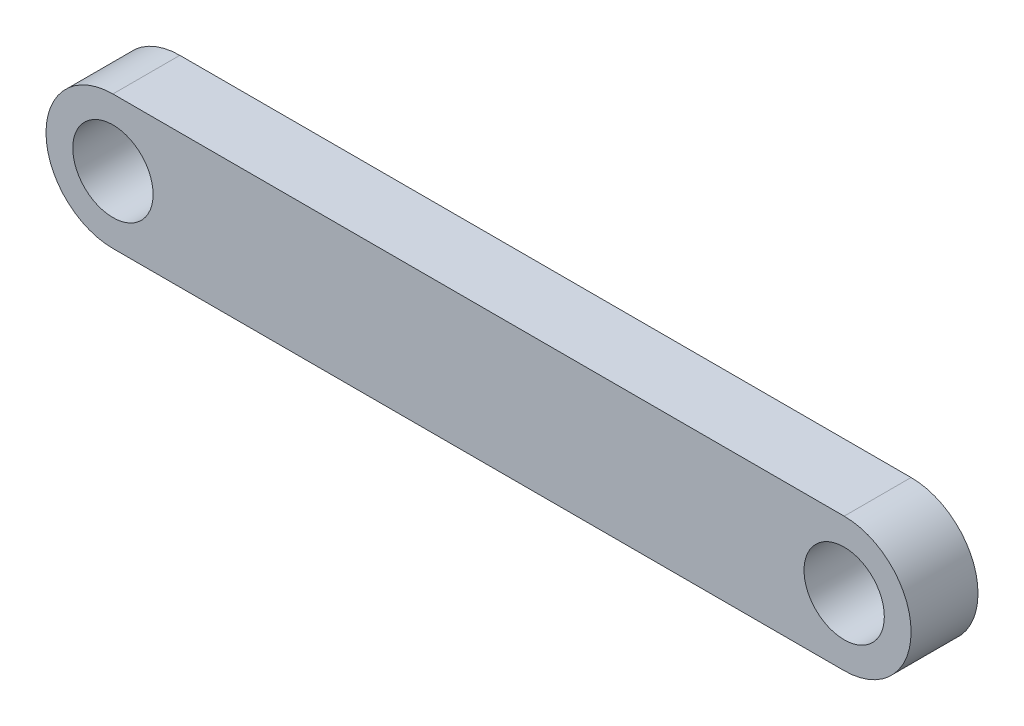
ISO-10303-21;
HEADER;
FILE_DESCRIPTION(('STEP AP214'),'2;1');
FILE_NAME('part.step','',(''),(''),'','','');
FILE_SCHEMA(('AUTOMOTIVE_DESIGN { 1 0 10303 214 1 1 1 1 }'));
ENDSEC;
DATA;
#1=APPLICATION_CONTEXT('core data for automotive mechanical design processes');
#2=APPLICATION_PROTOCOL_DEFINITION('international standard','automotive_design',2000,#1);
#3=PRODUCT_CONTEXT('',#1,'mechanical');
#4=PRODUCT('Part','Part','',(#3));
#5=PRODUCT_RELATED_PRODUCT_CATEGORY('part','',(#4));
#6=PRODUCT_DEFINITION_FORMATION('','',#4);
#7=PRODUCT_DEFINITION_CONTEXT('part definition',#1,'design');
#8=PRODUCT_DEFINITION('design','',#6,#7);
#9=PRODUCT_DEFINITION_SHAPE('','',#8);
#10=(LENGTH_UNIT() NAMED_UNIT(*) SI_UNIT(.MILLI.,.METRE.));
#11=(NAMED_UNIT(*) PLANE_ANGLE_UNIT() SI_UNIT($,.RADIAN.));
#12=(NAMED_UNIT(*) SI_UNIT($,.STERADIAN.) SOLID_ANGLE_UNIT());
#13=UNCERTAINTY_MEASURE_WITH_UNIT(LENGTH_MEASURE(1.E-05),#10,'distance_accuracy_value','');
#14=(GEOMETRIC_REPRESENTATION_CONTEXT(3) GLOBAL_UNCERTAINTY_ASSIGNED_CONTEXT((#13)) GLOBAL_UNIT_ASSIGNED_CONTEXT((#10,
#11,#12)) REPRESENTATION_CONTEXT('',''));
#15=CARTESIAN_POINT('',(0.,0.,0.));
#16=DIRECTION('',(0.,0.,1.));
#17=DIRECTION('',(1.,0.,0.));
#18=AXIS2_PLACEMENT_3D('',#15,#16,#17);
#19=CARTESIAN_POINT('',(27.3185,0.,5.));
#20=DIRECTION('',(0.,0.,-1.));
#21=DIRECTION('',(-1.,0.,0.));
#22=AXIS2_PLACEMENT_3D('',#19,#20,#21);
#23=PLANE('',#22);
#24=CARTESIAN_POINT('',(27.3185,0.,5.));
#25=DIRECTION('',(0.,0.,1.));
#26=DIRECTION('',(-1.,0.,0.));
#27=AXIS2_PLACEMENT_3D('',#24,#25,#26);
#28=CIRCLE('',#27,5.);
#29=CARTESIAN_POINT('',(27.3185,-5.,5.));
#30=VERTEX_POINT('',#29);
#31=CARTESIAN_POINT('',(27.3185,5.,5.));
#32=VERTEX_POINT('',#31);
#33=EDGE_CURVE('E91',#30,#32,#28,.T.);
#34=ORIENTED_EDGE('',*,*,#33,.T.);
#35=DIRECTION('',(-1.,0.,0.));
#36=VECTOR('',#35,1.);
#37=CARTESIAN_POINT('',(-27.3185,5.,5.));
#38=LINE('',#37,#36);
#39=CARTESIAN_POINT('',(-27.3185,5.,5.));
#40=VERTEX_POINT('',#39);
#41=EDGE_CURVE('E86',#32,#40,#38,.T.);
#42=ORIENTED_EDGE('',*,*,#41,.T.);
#43=CARTESIAN_POINT('',(-27.3185,0.,5.));
#44=DIRECTION('',(0.,0.,1.));
#45=DIRECTION('',(1.,0.,0.));
#46=AXIS2_PLACEMENT_3D('',#43,#44,#45);
#47=CIRCLE('',#46,5.);
#48=CARTESIAN_POINT('',(-27.3185,-5.,5.));
#49=VERTEX_POINT('',#48);
#50=EDGE_CURVE('E89',#40,#49,#47,.T.);
#51=ORIENTED_EDGE('',*,*,#50,.T.);
#52=DIRECTION('',(1.,0.,0.));
#53=VECTOR('',#52,1.);
#54=CARTESIAN_POINT('',(-27.3185,-5.,5.));
#55=LINE('',#54,#53);
#56=EDGE_CURVE('E56',#49,#30,#55,.T.);
#57=ORIENTED_EDGE('',*,*,#56,.T.);
#58=EDGE_LOOP('',(#34,#42,#51,#57));
#59=FACE_BOUND('',#58,.T.);
#60=CARTESIAN_POINT('',(-27.3185,0.,5.));
#61=DIRECTION('',(0.,0.,1.));
#62=DIRECTION('',(1.,0.,0.));
#63=AXIS2_PLACEMENT_3D('',#60,#61,#62);
#64=CIRCLE('',#63,3.);
#65=CARTESIAN_POINT('',(-24.3185,0.,5.));
#66=VERTEX_POINT('',#65);
#67=EDGE_CURVE('E106',#66,#66,#64,.T.);
#68=ORIENTED_EDGE('',*,*,#67,.F.);
#69=EDGE_LOOP('',(#68));
#70=FACE_BOUND('',#69,.T.);
#71=CARTESIAN_POINT('',(27.3185,0.,5.));
#72=DIRECTION('',(0.,0.,1.));
#73=DIRECTION('',(1.,0.,0.));
#74=AXIS2_PLACEMENT_3D('',#71,#72,#73);
#75=CIRCLE('',#74,3.);
#76=CARTESIAN_POINT('',(30.3185,0.,5.));
#77=VERTEX_POINT('',#76);
#78=EDGE_CURVE('E121',#77,#77,#75,.T.);
#79=ORIENTED_EDGE('',*,*,#78,.F.);
#80=EDGE_LOOP('',(#79));
#81=FACE_BOUND('',#80,.T.);
#82=ADVANCED_FACE('F39',(#59,#70,#81),#23,.F.);
#83=CARTESIAN_POINT('',(27.3185,0.,0.));
#84=DIRECTION('',(0.,0.,-1.));
#85=DIRECTION('',(-1.,0.,0.));
#86=AXIS2_PLACEMENT_3D('',#83,#84,#85);
#87=PLANE('',#86);
#88=CARTESIAN_POINT('',(-27.3185,0.,0.));
#89=DIRECTION('',(0.,0.,1.));
#90=DIRECTION('',(1.,0.,0.));
#91=AXIS2_PLACEMENT_3D('',#88,#89,#90);
#92=CIRCLE('',#91,3.);
#93=CARTESIAN_POINT('',(-24.3185,0.,0.));
#94=VERTEX_POINT('',#93);
#95=EDGE_CURVE('E118',#94,#94,#92,.T.);
#96=ORIENTED_EDGE('',*,*,#95,.T.);
#97=EDGE_LOOP('',(#96));
#98=FACE_BOUND('',#97,.T.);
#99=CARTESIAN_POINT('',(27.3185,0.,0.));
#100=DIRECTION('',(0.,0.,1.));
#101=DIRECTION('',(-1.,0.,0.));
#102=AXIS2_PLACEMENT_3D('',#99,#100,#101);
#103=CIRCLE('',#102,5.);
#104=CARTESIAN_POINT('',(27.3185,-5.,0.));
#105=VERTEX_POINT('',#104);
#106=CARTESIAN_POINT('',(27.3185,5.,0.));
#107=VERTEX_POINT('',#106);
#108=EDGE_CURVE('E103',#105,#107,#103,.T.);
#109=ORIENTED_EDGE('',*,*,#108,.F.);
#110=DIRECTION('',(1.,0.,0.));
#111=VECTOR('',#110,1.);
#112=CARTESIAN_POINT('',(-27.3185,-5.,0.));
#113=LINE('',#112,#111);
#114=CARTESIAN_POINT('',(-27.3185,-5.,0.));
#115=VERTEX_POINT('',#114);
#116=EDGE_CURVE('E79',#115,#105,#113,.T.);
#117=ORIENTED_EDGE('',*,*,#116,.F.);
#118=CARTESIAN_POINT('',(-27.3185,0.,0.));
#119=DIRECTION('',(0.,0.,1.));
#120=DIRECTION('',(1.,0.,0.));
#121=AXIS2_PLACEMENT_3D('',#118,#119,#120);
#122=CIRCLE('',#121,5.);
#123=CARTESIAN_POINT('',(-27.3185,5.,0.));
#124=VERTEX_POINT('',#123);
#125=EDGE_CURVE('E73',#124,#115,#122,.T.);
#126=ORIENTED_EDGE('',*,*,#125,.F.);
#127=DIRECTION('',(-1.,0.,0.));
#128=VECTOR('',#127,1.);
#129=CARTESIAN_POINT('',(-27.3185,5.,0.));
#130=LINE('',#129,#128);
#131=EDGE_CURVE('E95',#107,#124,#130,.T.);
#132=ORIENTED_EDGE('',*,*,#131,.F.);
#133=EDGE_LOOP('',(#109,#117,#126,#132));
#134=FACE_BOUND('',#133,.T.);
#135=CARTESIAN_POINT('',(27.3185,0.,0.));
#136=DIRECTION('',(0.,0.,1.));
#137=DIRECTION('',(1.,0.,0.));
#138=AXIS2_PLACEMENT_3D('',#135,#136,#137);
#139=CIRCLE('',#138,3.);
#140=CARTESIAN_POINT('',(30.3185,0.,0.));
#141=VERTEX_POINT('',#140);
#142=EDGE_CURVE('E124',#141,#141,#139,.T.);
#143=ORIENTED_EDGE('',*,*,#142,.T.);
#144=EDGE_LOOP('',(#143));
#145=FACE_BOUND('',#144,.T.);
#146=ADVANCED_FACE('F114',(#98,#134,#145),#87,.T.);
#147=CARTESIAN_POINT('',(27.3185,0.,5.));
#148=DIRECTION('',(0.,0.,-1.));
#149=DIRECTION('',(-1.,0.,0.));
#150=AXIS2_PLACEMENT_3D('',#147,#148,#149);
#151=CYLINDRICAL_SURFACE('',#150,5.);
#152=ORIENTED_EDGE('',*,*,#108,.T.);
#153=DIRECTION('',(0.,0.,-1.));
#154=VECTOR('',#153,1.);
#155=CARTESIAN_POINT('',(27.3185,5.,5.));
#156=LINE('',#155,#154);
#157=EDGE_CURVE('E11',#32,#107,#156,.T.);
#158=ORIENTED_EDGE('',*,*,#157,.F.);
#159=ORIENTED_EDGE('',*,*,#33,.F.);
#160=DIRECTION('',(0.,0.,-1.));
#161=VECTOR('',#160,1.);
#162=CARTESIAN_POINT('',(27.3185,-5.,5.));
#163=LINE('',#162,#161);
#164=EDGE_CURVE('E99',#30,#105,#163,.T.);
#165=ORIENTED_EDGE('',*,*,#164,.T.);
#166=EDGE_LOOP('',(#152,#158,#159,#165));
#167=FACE_BOUND('',#166,.T.);
#168=ADVANCED_FACE('F41',(#167),#151,.T.);
#169=CARTESIAN_POINT('',(-27.3185,5.,5.));
#170=DIRECTION('',(0.,-1.,0.));
#171=DIRECTION('',(0.,0.,-1.));
#172=AXIS2_PLACEMENT_3D('',#169,#170,#171);
#173=PLANE('',#172);
#174=ORIENTED_EDGE('',*,*,#131,.T.);
#175=DIRECTION('',(0.,0.,-1.));
#176=VECTOR('',#175,1.);
#177=CARTESIAN_POINT('',(-27.3185,5.,5.));
#178=LINE('',#177,#176);
#179=EDGE_CURVE('E48',#40,#124,#178,.T.);
#180=ORIENTED_EDGE('',*,*,#179,.F.);
#181=ORIENTED_EDGE('',*,*,#41,.F.);
#182=ORIENTED_EDGE('',*,*,#157,.T.);
#183=EDGE_LOOP('',(#174,#180,#181,#182));
#184=FACE_BOUND('',#183,.T.);
#185=ADVANCED_FACE('F94',(#184),#173,.F.);
#186=CARTESIAN_POINT('',(-27.3185,0.,5.));
#187=DIRECTION('',(0.,0.,-1.));
#188=DIRECTION('',(-1.,0.,0.));
#189=AXIS2_PLACEMENT_3D('',#186,#187,#188);
#190=CYLINDRICAL_SURFACE('',#189,5.);
#191=ORIENTED_EDGE('',*,*,#125,.T.);
#192=DIRECTION('',(0.,0.,-1.));
#193=VECTOR('',#192,1.);
#194=CARTESIAN_POINT('',(-27.3185,-5.,5.));
#195=LINE('',#194,#193);
#196=EDGE_CURVE('E96',#49,#115,#195,.T.);
#197=ORIENTED_EDGE('',*,*,#196,.F.);
#198=ORIENTED_EDGE('',*,*,#50,.F.);
#199=ORIENTED_EDGE('',*,*,#179,.T.);
#200=EDGE_LOOP('',(#191,#197,#198,#199));
#201=FACE_BOUND('',#200,.T.);
#202=ADVANCED_FACE('F97',(#201),#190,.T.);
#203=CARTESIAN_POINT('',(-27.3185,-5.,5.));
#204=DIRECTION('',(0.,1.,0.));
#205=DIRECTION('',(0.,0.,1.));
#206=AXIS2_PLACEMENT_3D('',#203,#204,#205);
#207=PLANE('',#206);
#208=ORIENTED_EDGE('',*,*,#116,.T.);
#209=ORIENTED_EDGE('',*,*,#164,.F.);
#210=ORIENTED_EDGE('',*,*,#56,.F.);
#211=ORIENTED_EDGE('',*,*,#196,.T.);
#212=EDGE_LOOP('',(#208,#209,#210,#211));
#213=FACE_BOUND('',#212,.T.);
#214=ADVANCED_FACE('F111',(#213),#207,.F.);
#215=CARTESIAN_POINT('',(-27.3185,0.,5.));
#216=DIRECTION('',(0.,0.,-1.));
#217=DIRECTION('',(-1.,0.,0.));
#218=AXIS2_PLACEMENT_3D('',#215,#216,#217);
#219=CYLINDRICAL_SURFACE('',#218,3.);
#220=ORIENTED_EDGE('',*,*,#67,.T.);
#221=EDGE_LOOP('',(#220));
#222=FACE_BOUND('',#221,.T.);
#223=ORIENTED_EDGE('',*,*,#95,.F.);
#224=EDGE_LOOP('',(#223));
#225=FACE_BOUND('',#224,.T.);
#226=ADVANCED_FACE('F141',(#222,#225),#219,.F.);
#227=CARTESIAN_POINT('',(27.3185,0.,5.));
#228=DIRECTION('',(0.,0.,-1.));
#229=DIRECTION('',(-1.,0.,0.));
#230=AXIS2_PLACEMENT_3D('',#227,#228,#229);
#231=CYLINDRICAL_SURFACE('',#230,3.);
#232=ORIENTED_EDGE('',*,*,#78,.T.);
#233=EDGE_LOOP('',(#232));
#234=FACE_BOUND('',#233,.T.);
#235=ORIENTED_EDGE('',*,*,#142,.F.);
#236=EDGE_LOOP('',(#235));
#237=FACE_BOUND('',#236,.T.);
#238=ADVANCED_FACE('F130',(#234,#237),#231,.F.);
#239=CLOSED_SHELL('',(#82,#146,#168,#185,#202,#214,#226,#238));
#240=MANIFOLD_SOLID_BREP('B2',#239);
#241=ADVANCED_BREP_SHAPE_REPRESENTATION('',(#18,#240),#14);
#242=SHAPE_DEFINITION_REPRESENTATION(#9,#241);
ENDSEC;
END-ISO-10303-21;
